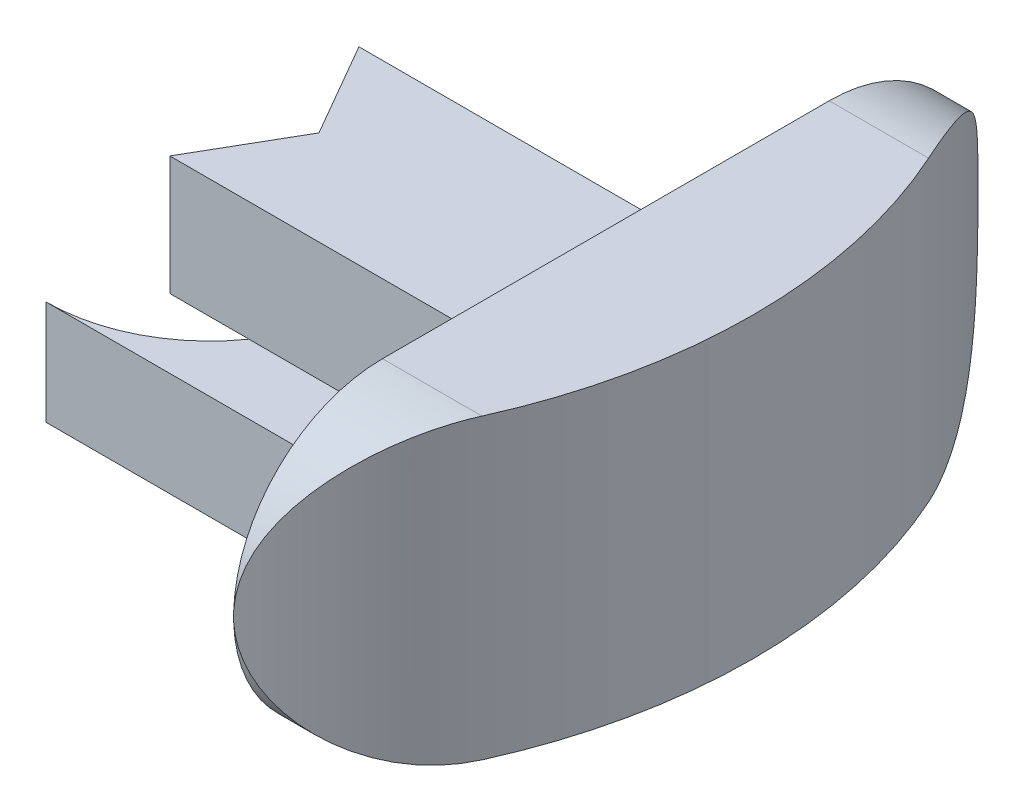
ISO-10303-21;
HEADER;
FILE_DESCRIPTION(('STEP AP214'),'2;1');
FILE_NAME('part.step','',(''),(''),'','','');
FILE_SCHEMA(('AUTOMOTIVE_DESIGN { 1 0 10303 214 1 1 1 1 }'));
ENDSEC;
DATA;
#1=APPLICATION_CONTEXT('core data for automotive mechanical design processes');
#2=APPLICATION_PROTOCOL_DEFINITION('international standard','automotive_design',2000,#1);
#3=PRODUCT_CONTEXT('',#1,'mechanical');
#4=PRODUCT('Part','Part','',(#3));
#5=PRODUCT_RELATED_PRODUCT_CATEGORY('part','',(#4));
#6=PRODUCT_DEFINITION_FORMATION('','',#4);
#7=PRODUCT_DEFINITION_CONTEXT('part definition',#1,'design');
#8=PRODUCT_DEFINITION('design','',#6,#7);
#9=PRODUCT_DEFINITION_SHAPE('','',#8);
#10=(LENGTH_UNIT() NAMED_UNIT(*) SI_UNIT(.MILLI.,.METRE.));
#11=(NAMED_UNIT(*) PLANE_ANGLE_UNIT() SI_UNIT($,.RADIAN.));
#12=(NAMED_UNIT(*) SI_UNIT($,.STERADIAN.) SOLID_ANGLE_UNIT());
#13=UNCERTAINTY_MEASURE_WITH_UNIT(LENGTH_MEASURE(1.E-05),#10,'distance_accuracy_value','');
#14=(GEOMETRIC_REPRESENTATION_CONTEXT(3) GLOBAL_UNCERTAINTY_ASSIGNED_CONTEXT((#13)) GLOBAL_UNIT_ASSIGNED_CONTEXT((#10,
#11,#12)) REPRESENTATION_CONTEXT('',''));
#15=CARTESIAN_POINT('',(0.,0.,0.));
#16=DIRECTION('',(0.,0.,1.));
#17=DIRECTION('',(1.,0.,0.));
#18=AXIS2_PLACEMENT_3D('',#15,#16,#17);
#19=CARTESIAN_POINT('',(38.6,9.,15.));
#20=DIRECTION('',(-1.,0.,0.));
#21=DIRECTION('',(0.,0.,1.));
#22=AXIS2_PLACEMENT_3D('',#19,#20,#21);
#23=CYLINDRICAL_SURFACE('',#22,10.);
#24=CARTESIAN_POINT('',(26.6,9.35210357890602,24.9937992310093));
#25=CARTESIAN_POINT('',(26.6039731203121,9.47222148989784,24.9895691163679));
#26=CARTESIAN_POINT('',(26.6099836757449,9.59217462653272,24.9831721240557));
#27=CARTESIAN_POINT('',(26.6260093181641,9.83149513122165,24.9660926348705));
#28=CARTESIAN_POINT('',(26.6360239991944,9.95086255741615,24.9554105724366));
#29=CARTESIAN_POINT('',(26.6719358160613,10.3073933716122,24.9170443314133));
#30=CARTESIAN_POINT('',(26.7037126734984,10.5433351910731,24.8830275327855));
#31=CARTESIAN_POINT('',(26.7815347884246,11.00745523268,24.7992460144271));
#32=CARTESIAN_POINT('',(26.8274355277001,11.2356872201852,24.7496406947013));
#33=CARTESIAN_POINT('',(26.932295723982,11.6853537574777,24.6354916418739));
#34=CARTESIAN_POINT('',(26.991258608686,11.9067865056471,24.5709439874854));
#35=CARTESIAN_POINT('',(27.1204402577183,12.3405691151106,24.4282809680551));
#36=CARTESIAN_POINT('',(27.1906040587261,12.5529572229503,24.3502317070687));
#37=CARTESIAN_POINT('',(27.3408497093302,12.9688869575278,24.1814131233275));
#38=CARTESIAN_POINT('',(27.4209308784282,13.1724291899483,24.0906446732672));
#39=CARTESIAN_POINT('',(27.6743704848657,13.7701808245318,23.8001069645739));
#40=CARTESIAN_POINT('',(27.8606044340125,14.1504791149211,23.5824531097887));
#41=CARTESIAN_POINT('',(28.2000039212504,14.7682354009671,23.1745331008671));
#42=CARTESIAN_POINT('',(28.3475099055874,15.0155563823267,22.994083759587));
#43=CARTESIAN_POINT('',(28.6514060971131,15.4895917973768,22.6142879990519));
#44=CARTESIAN_POINT('',(28.8077993802628,15.7162990250327,22.414935020946));
#45=CARTESIAN_POINT('',(29.1267840011027,16.1488689543995,21.9988471706816));
#46=CARTESIAN_POINT('',(29.2893814250526,16.3547104234367,21.7820949872696));
#47=CARTESIAN_POINT('',(29.6182532046133,16.7449790010403,21.3327583969444));
#48=CARTESIAN_POINT('',(29.7845271701767,16.9294083683817,21.1001756641186));
#49=CARTESIAN_POINT('',(30.1209078010059,17.2787154936786,20.617193330868));
#50=CARTESIAN_POINT('',(30.2910360910303,17.4433032419393,20.3665991717779));
#51=CARTESIAN_POINT('',(30.6310669120968,17.7494270694321,19.8515231821659));
#52=CARTESIAN_POINT('',(30.8009694250494,17.890961400456,19.5870403004308));
#53=CARTESIAN_POINT('',(31.1384956563494,18.1498993674255,19.0458817443353));
#54=CARTESIAN_POINT('',(31.3061228830653,18.2673453726141,18.7692285361208));
#55=CARTESIAN_POINT('',(31.6377846067367,18.4774037252825,18.2046069416841));
#56=CARTESIAN_POINT('',(31.8018198369269,18.570021185241,17.916640898926));
#57=CARTESIAN_POINT('',(32.0791905274255,18.7068029363687,17.4135923931046));
#58=CARTESIAN_POINT('',(32.1937659429095,18.7572645594182,17.2008840338201));
#59=CARTESIAN_POINT('',(32.4197596702063,18.8443613770289,16.7710500861131));
#60=CARTESIAN_POINT('',(32.531178701237,18.8809997451982,16.5539255236621));
#61=CARTESIAN_POINT('',(32.7504830719602,18.940026537726,16.1157031253022));
#62=CARTESIAN_POINT('',(32.8583647834857,18.9624007401129,15.894601549213));
#63=CARTESIAN_POINT('',(33.0700530696425,18.9923925742663,15.4493567138761));
#64=CARTESIAN_POINT('',(33.173857916813,19.0000040154176,15.2252122182677));
#65=CARTESIAN_POINT('',(33.2753662639497,19.,15.));
#66=B_SPLINE_CURVE_WITH_KNOTS('',3,(#24,#25,#26,#27,#28,#29,#30,#31,#32,#33,#34,#35,#36,#37,#38,
#39,#40,#41,#42,#43,#44,#45,#46,#47,#48,#49,#50,#51,#52,#53,#54,#55,#56,#57,#58,#59,#60,#61,#62,
#63,#64,#65),.UNSPECIFIED.,.F.,.F.,(4,2,2,2,2,2,2,2,2,2,2,2,2,2,2,2,2,2,2,2,4),(0.,
0.360696887689983,0.721357215585299,1.44163142570809,2.1547678332582,2.86809160035052,
3.57801696587919,4.28789364553995,5.71103021487599,6.72940755807806,7.74813954186572,
8.76789797910362,9.78754874350245,10.820650274358,11.8538301118869,12.8851767906448,
13.9163109400388,14.6563538847725,15.396226823419,16.1368362974722,16.8777562715601),.UNSPECIFIED.);
#67=CARTESIAN_POINT('',(26.6,9.35210357890602,24.9937992310093));
#68=VERTEX_POINT('',#67);
#69=CARTESIAN_POINT('',(33.2753662639497,19.,15.));
#70=VERTEX_POINT('',#69);
#71=EDGE_CURVE('E158',#68,#70,#66,.T.);
#72=ORIENTED_EDGE('',*,*,#71,.T.);
#73=DIRECTION('',(-1.,0.,0.));
#74=VECTOR('',#73,1.);
#75=CARTESIAN_POINT('',(38.6,19.,15.));
#76=LINE('',#75,#74);
#77=CARTESIAN_POINT('',(26.6,19.,15.));
#78=VERTEX_POINT('',#77);
#79=EDGE_CURVE('E168',#70,#78,#76,.T.);
#80=ORIENTED_EDGE('',*,*,#79,.T.);
#81=CARTESIAN_POINT('',(26.6,9.,15.));
#82=DIRECTION('',(1.,0.,0.));
#83=DIRECTION('',(0.,0.,-1.));
#84=AXIS2_PLACEMENT_3D('',#81,#82,#83);
#85=CIRCLE('',#84,10.);
#86=EDGE_CURVE('E171',#78,#68,#85,.T.);
#87=ORIENTED_EDGE('',*,*,#86,.T.);
#88=EDGE_LOOP('',(#72,#80,#87));
#89=FACE_BOUND('',#88,.T.);
#90=ADVANCED_FACE('F39',(#89),#23,.T.);
#91=CARTESIAN_POINT('',(33.2753662639497,-0.999999999999999,15.));
#92=CARTESIAN_POINT('',(33.2037865882117,-0.999999200723147,15.1587936888618));
#93=CARTESIAN_POINT('',(33.1310782846771,-0.996217368887177,15.3170474964813));
#94=CARTESIAN_POINT('',(32.983551014986,-0.981243258435668,15.632197931669));
#95=CARTESIAN_POINT('',(32.9087322486585,-0.970051679172206,15.7890946859039));
#96=CARTESIAN_POINT('',(32.6814416490848,-0.925614448949604,16.2571060527177));
#97=CARTESIAN_POINT('',(32.5260102593238,-0.881505765902623,16.5658194648159));
#98=CARTESIAN_POINT('',(32.2093664447421,-0.765852173988446,17.1733418193444));
#99=CARTESIAN_POINT('',(32.0481793474853,-0.694416593382656,17.4721851394315));
#100=CARTESIAN_POINT('',(31.7208564940151,-0.52533868953043,18.0596325433727));
#101=CARTESIAN_POINT('',(31.5547198931167,-0.427691870018089,18.3482348608635));
#102=CARTESIAN_POINT('',(31.2195299630825,-0.207641539747412,18.9129185785973));
#103=CARTESIAN_POINT('',(31.0504854463167,-0.0853037626601614,19.1890308900462));
#104=CARTESIAN_POINT('',(30.710709715046,0.183289997128776,19.7282502616563));
#105=CARTESIAN_POINT('',(30.5399785708766,0.329544986359115,19.9913578614154));
#106=CARTESIAN_POINT('',(30.1981552217356,0.645586634233804,20.5040629171745));
#107=CARTESIAN_POINT('',(30.0270632527174,0.815434364542404,20.7536228939839));
#108=CARTESIAN_POINT('',(29.6869542053374,1.17774856811761,21.2372823001177));
#109=CARTESIAN_POINT('',(29.5179372012982,1.37021584899071,21.471381176954));
#110=CARTESIAN_POINT('',(29.1726261725967,1.79147489856458,21.9385041761919));
#111=CARTESIAN_POINT('',(28.9966418679754,2.02186100928856,22.1703247574055));
#112=CARTESIAN_POINT('',(28.6527595051738,2.50768260533797,22.6130038520815));
#113=CARTESIAN_POINT('',(28.4848634624896,2.76312428655226,22.8238571545411));
#114=CARTESIAN_POINT('',(28.1614064883706,3.29795876177211,23.2217734856163));
#115=CARTESIAN_POINT('',(28.0058154397984,3.57728935958834,23.4088953223027));
#116=CARTESIAN_POINT('',(27.7110505891913,4.15973325426129,23.7570970869388));
#117=CARTESIAN_POINT('',(27.5718643608662,4.4628282564982,23.9181967608236));
#118=CARTESIAN_POINT('',(27.3640462815147,4.97154950659899,24.1551968638334));
#119=CARTESIAN_POINT('',(27.2887460982583,5.17028193133811,24.240163851239));
#120=CARTESIAN_POINT('',(27.1477418857148,5.57577473182526,24.3979773136989));
#121=CARTESIAN_POINT('',(27.0820348559638,5.78253257173094,24.4708275795138));
#122=CARTESIAN_POINT('',(26.9617144970543,6.20278290506659,24.603332177387));
#123=CARTESIAN_POINT('',(26.907073481219,6.41625700731799,24.663019476767));
#124=CARTESIAN_POINT('',(26.8099938118942,6.84924870524917,24.7685158164426));
#125=CARTESIAN_POINT('',(26.7675503487429,7.0687638813337,24.8143303273521));
#126=CARTESIAN_POINT('',(26.6958783045771,7.51314712116637,24.8914218223452));
#127=CARTESIAN_POINT('',(26.6666859709828,7.73802811728294,24.9226589375789));
#128=CARTESIAN_POINT('',(26.6335698292879,8.07768422252846,24.9580288905352));
#129=CARTESIAN_POINT('',(26.6243066555495,8.19138564798315,24.967907943908));
#130=CARTESIAN_POINT('',(26.6094132579338,8.41930738077499,24.9837793566777));
#131=CARTESIAN_POINT('',(26.6037833885578,8.53352773764968,24.9897713368132));
#132=CARTESIAN_POINT('',(26.6,8.64789642109398,24.9937992310093));
#133=B_SPLINE_CURVE_WITH_KNOTS('',3,(#91,#92,#93,#94,#95,#96,#97,#98,#99,#100,#101,#102,#103,
#104,#105,#106,#107,#108,#109,#110,#111,#112,#113,#114,#115,#116,#117,#118,#119,#120,#121,#122,
#123,#124,#125,#126,#127,#128,#129,#130,#131,#132),.UNSPECIFIED.,.F.,.F.,(4,2,2,2,2,2,2,2,2,2,2,
2,2,2,2,2,2,2,2,2,4),(0.,0.522445037323779,1.04484077189456,2.08872160109848,3.12846907125589,
4.16839501340292,5.20558808367008,6.24273808202821,7.28262467061778,8.32254839851456,
9.43468770219956,10.5471027189163,11.656704876063,12.7654610574862,13.4515167750725,
14.1373574522418,14.8214603904824,15.505293206287,16.1909854842,16.534391837958,
16.8778316928012),.UNSPECIFIED.);
#134=CARTESIAN_POINT('',(33.2753662639497,-1.,15.));
#135=VERTEX_POINT('',#134);
#136=CARTESIAN_POINT('',(26.6,8.64789642109398,24.9937992310093));
#137=VERTEX_POINT('',#136);
#138=EDGE_CURVE('E320',#135,#137,#133,.T.);
#139=ORIENTED_EDGE('',*,*,#138,.T.);
#140=CARTESIAN_POINT('',(26.6,-1.,15.));
#141=VERTEX_POINT('',#140);
#142=EDGE_CURVE('E173',#137,#141,#85,.T.);
#143=ORIENTED_EDGE('',*,*,#142,.T.);
#144=DIRECTION('',(-1.,0.,0.));
#145=VECTOR('',#144,1.);
#146=CARTESIAN_POINT('',(38.6,-1.,15.));
#147=LINE('',#146,#145);
#148=EDGE_CURVE('E192',#135,#141,#147,.T.);
#149=ORIENTED_EDGE('',*,*,#148,.F.);
#150=EDGE_LOOP('',(#139,#143,#149));
#151=FACE_BOUND('',#150,.T.);
#152=ADVANCED_FACE('F319',(#151),#23,.T.);
#153=CARTESIAN_POINT('',(38.6,-1.,15.));
#154=DIRECTION('',(0.,1.,0.));
#155=DIRECTION('',(0.,0.,1.));
#156=AXIS2_PLACEMENT_3D('',#153,#154,#155);
#157=PLANE('',#156);
#158=CARTESIAN_POINT('',(0.,-1.,0.));
#159=DIRECTION('',(0.,1.,0.));
#160=DIRECTION('',(0.,0.,1.));
#161=AXIS2_PLACEMENT_3D('',#158,#159,#160);
#162=CIRCLE('',#161,36.5);
#163=CARTESIAN_POINT('',(33.2753662639497,-1.,-15.));
#164=VERTEX_POINT('',#163);
#165=EDGE_CURVE('E328',#164,#135,#162,.F.);
#166=ORIENTED_EDGE('',*,*,#165,.T.);
#167=ORIENTED_EDGE('',*,*,#148,.T.);
#168=DIRECTION('',(0.,0.,-1.));
#169=VECTOR('',#168,1.);
#170=CARTESIAN_POINT('',(26.6,-1.,15.));
#171=LINE('',#170,#169);
#172=CARTESIAN_POINT('',(26.6,-1.,-15.));
#173=VERTEX_POINT('',#172);
#174=EDGE_CURVE('E300',#141,#173,#171,.T.);
#175=ORIENTED_EDGE('',*,*,#174,.T.);
#176=DIRECTION('',(-1.,0.,0.));
#177=VECTOR('',#176,1.);
#178=CARTESIAN_POINT('',(38.6,-1.,-15.));
#179=LINE('',#178,#177);
#180=EDGE_CURVE('E184',#164,#173,#179,.T.);
#181=ORIENTED_EDGE('',*,*,#180,.F.);
#182=EDGE_LOOP('',(#166,#167,#175,#181));
#183=FACE_BOUND('',#182,.T.);
#184=ADVANCED_FACE('F325',(#183),#157,.F.);
#185=CARTESIAN_POINT('',(38.6,9.,-15.));
#186=DIRECTION('',(-1.,0.,0.));
#187=DIRECTION('',(0.,0.,1.));
#188=AXIS2_PLACEMENT_3D('',#185,#186,#187);
#189=CYLINDRICAL_SURFACE('',#188,10.);
#190=CARTESIAN_POINT('',(26.6,8.64789642109398,-24.9937992310093));
#191=CARTESIAN_POINT('',(26.603973120312,8.52777851010216,-24.9895691163679));
#192=CARTESIAN_POINT('',(26.6099836757449,8.40782537346729,-24.9831721240557));
#193=CARTESIAN_POINT('',(26.6260093181641,8.16850486877835,-24.9660926348705));
#194=CARTESIAN_POINT('',(26.6360239991944,8.04913744258385,-24.9554105724366));
#195=CARTESIAN_POINT('',(26.6719358160613,7.69260662838783,-24.9170443314133));
#196=CARTESIAN_POINT('',(26.7037126734984,7.45666480892686,-24.8830275327855));
#197=CARTESIAN_POINT('',(26.7815347884246,6.99254476732002,-24.7992460144271));
#198=CARTESIAN_POINT('',(26.8274355277001,6.76431277981484,-24.7496406947013));
#199=CARTESIAN_POINT('',(26.932295723982,6.3146462425223,-24.6354916418739));
#200=CARTESIAN_POINT('',(26.991258608686,6.09321349435291,-24.5709439874854));
#201=CARTESIAN_POINT('',(27.1204402577183,5.6594308848894,-24.4282809680551));
#202=CARTESIAN_POINT('',(27.1906040587261,5.44704277704972,-24.3502317070687));
#203=CARTESIAN_POINT('',(27.3408497093302,5.03111304247218,-24.1814131233275));
#204=CARTESIAN_POINT('',(27.4209308784282,4.82757081005165,-24.0906446732672));
#205=CARTESIAN_POINT('',(27.6743704848657,4.22981917546823,-23.8001069645739));
#206=CARTESIAN_POINT('',(27.8606044340125,3.84952088507887,-23.5824531097887));
#207=CARTESIAN_POINT('',(28.2000039212504,3.23176459903291,-23.1745331008671));
#208=CARTESIAN_POINT('',(28.3475099055874,2.98444361767329,-22.994083759587));
#209=CARTESIAN_POINT('',(28.6514060971131,2.51040820262317,-22.6142879990519));
#210=CARTESIAN_POINT('',(28.8077993802628,2.28370097496727,-22.414935020946));
#211=CARTESIAN_POINT('',(29.1267840011027,1.85113104560049,-21.9988471706816));
#212=CARTESIAN_POINT('',(29.2893814250526,1.64528957656329,-21.7820949872696));
#213=CARTESIAN_POINT('',(29.6182532046133,1.25502099895968,-21.3327583969444));
#214=CARTESIAN_POINT('',(29.7845271701767,1.07059163161831,-21.1001756641186));
#215=CARTESIAN_POINT('',(30.1209078010059,0.721284506321408,-20.617193330868));
#216=CARTESIAN_POINT('',(30.2910360910303,0.556696758060669,-20.3665991717779));
#217=CARTESIAN_POINT('',(30.6310669120968,0.250572930567931,-19.8515231821659));
#218=CARTESIAN_POINT('',(30.8009694250494,0.109038599543993,-19.5870403004308));
#219=CARTESIAN_POINT('',(31.1384956563494,-0.149899367425552,-19.0458817443353));
#220=CARTESIAN_POINT('',(31.3061228830653,-0.267345372614133,-18.7692285361208));
#221=CARTESIAN_POINT('',(31.6377846067367,-0.47740372528254,-18.2046069416841));
#222=CARTESIAN_POINT('',(31.8018198369269,-0.570021185240969,-17.916640898926));
#223=CARTESIAN_POINT('',(32.0791905274255,-0.706802936368719,-17.4135923931046));
#224=CARTESIAN_POINT('',(32.1937659429095,-0.757264559418187,-17.2008840338201));
#225=CARTESIAN_POINT('',(32.4197596702063,-0.844361377028892,-16.7710500861131));
#226=CARTESIAN_POINT('',(32.531178701237,-0.880999745198182,-16.5539255236621));
#227=CARTESIAN_POINT('',(32.7504830719602,-0.940026537725965,-16.1157031253022));
#228=CARTESIAN_POINT('',(32.8583647834857,-0.962400740112905,-15.894601549213));
#229=CARTESIAN_POINT('',(33.0700530696425,-0.992392574266326,-15.4493567138761));
#230=CARTESIAN_POINT('',(33.173857916813,-1.00000401541757,-15.2252122182677));
#231=CARTESIAN_POINT('',(33.2753662639497,-1.,-15.));
#232=B_SPLINE_CURVE_WITH_KNOTS('',3,(#190,#191,#192,#193,#194,#195,#196,#197,#198,#199,#200,
#201,#202,#203,#204,#205,#206,#207,#208,#209,#210,#211,#212,#213,#214,#215,#216,#217,#218,#219,
#220,#221,#222,#223,#224,#225,#226,#227,#228,#229,#230,#231),.UNSPECIFIED.,.F.,.F.,(4,2,2,2,2,2,
2,2,2,2,2,2,2,2,2,2,2,2,2,2,4),(0.,0.360696887689983,0.721357215585299,1.44163142570809,
2.15476783325819,2.86809160035051,3.57801696587919,4.28789364553996,5.71103021487599,
6.72940755807806,7.74813954186572,8.76789797910363,9.78754874350245,10.820650274358,
11.8538301118869,12.8851767906448,13.9163109400388,14.6563538847725,15.396226823419,
16.1368362974722,16.8777562715601),.UNSPECIFIED.);
#233=CARTESIAN_POINT('',(26.6,8.64789642109398,-24.9937992310093));
#234=VERTEX_POINT('',#233);
#235=EDGE_CURVE('E307',#234,#164,#232,.T.);
#236=ORIENTED_EDGE('',*,*,#235,.T.);
#237=ORIENTED_EDGE('',*,*,#180,.T.);
#238=CARTESIAN_POINT('',(26.6,9.,-15.));
#239=DIRECTION('',(1.,0.,0.));
#240=DIRECTION('',(0.,0.,-1.));
#241=AXIS2_PLACEMENT_3D('',#238,#239,#240);
#242=CIRCLE('',#241,10.);
#243=EDGE_CURVE('E186',#173,#234,#242,.T.);
#244=ORIENTED_EDGE('',*,*,#243,.T.);
#245=EDGE_LOOP('',(#236,#237,#244));
#246=FACE_BOUND('',#245,.T.);
#247=ADVANCED_FACE('F336',(#246),#189,.T.);
#248=CARTESIAN_POINT('',(33.2753662639497,19.,-15.));
#249=CARTESIAN_POINT('',(33.2037865882117,18.9999992007231,-15.1587936888618));
#250=CARTESIAN_POINT('',(33.1310782846771,18.9962173688872,-15.3170474964813));
#251=CARTESIAN_POINT('',(32.983551014986,18.9812432584357,-15.632197931669));
#252=CARTESIAN_POINT('',(32.9087322486585,18.9700516791722,-15.7890946859039));
#253=CARTESIAN_POINT('',(32.6814416490848,18.9256144489496,-16.2571060527177));
#254=CARTESIAN_POINT('',(32.5260102593239,18.8815057659026,-16.5658194648159));
#255=CARTESIAN_POINT('',(32.2093664447421,18.7658521739884,-17.1733418193444));
#256=CARTESIAN_POINT('',(32.0481793474853,18.6944165933827,-17.4721851394315));
#257=CARTESIAN_POINT('',(31.7208564940151,18.5253386895304,-18.0596325433727));
#258=CARTESIAN_POINT('',(31.5547198931166,18.4276918700181,-18.3482348608635));
#259=CARTESIAN_POINT('',(31.2195299630824,18.2076415397474,-18.9129185785973));
#260=CARTESIAN_POINT('',(31.0504854463167,18.0853037626602,-19.1890308900462));
#261=CARTESIAN_POINT('',(30.710709715046,17.8167100028712,-19.7282502616563));
#262=CARTESIAN_POINT('',(30.5399785708766,17.6704550136409,-19.9913578614154));
#263=CARTESIAN_POINT('',(30.1981552217356,17.3544133657662,-20.5040629171746));
#264=CARTESIAN_POINT('',(30.0270632527174,17.1845656354576,-20.7536228939839));
#265=CARTESIAN_POINT('',(29.6869542053374,16.8222514318824,-21.2372823001177));
#266=CARTESIAN_POINT('',(29.5179372012982,16.6297841510093,-21.471381176954));
#267=CARTESIAN_POINT('',(29.1726261725967,16.2085251014354,-21.9385041761919));
#268=CARTESIAN_POINT('',(28.9966418679754,15.9781389907114,-22.1703247574056));
#269=CARTESIAN_POINT('',(28.6527595051738,15.492317394662,-22.6130038520815));
#270=CARTESIAN_POINT('',(28.4848634624896,15.2368757134477,-22.8238571545411));
#271=CARTESIAN_POINT('',(28.1614064883706,14.7020412382279,-23.2217734856163));
#272=CARTESIAN_POINT('',(28.0058154397984,14.4227106404117,-23.4088953223027));
#273=CARTESIAN_POINT('',(27.7110505891913,13.8402667457387,-23.7570970869389));
#274=CARTESIAN_POINT('',(27.5718643608662,13.5371717435018,-23.9181967608236));
#275=CARTESIAN_POINT('',(27.3640462815147,13.028450493401,-24.1551968638334));
#276=CARTESIAN_POINT('',(27.2887460982583,12.8297180686619,-24.240163851239));
#277=CARTESIAN_POINT('',(27.1477418857148,12.4242252681747,-24.3979773136989));
#278=CARTESIAN_POINT('',(27.0820348559638,12.2174674282691,-24.4708275795138));
#279=CARTESIAN_POINT('',(26.9617144970543,11.7972170949334,-24.603332177387));
#280=CARTESIAN_POINT('',(26.907073481219,11.583742992682,-24.663019476767));
#281=CARTESIAN_POINT('',(26.8099938118942,11.1507512947508,-24.7685158164426));
#282=CARTESIAN_POINT('',(26.7675503487429,10.9312361186663,-24.8143303273521));
#283=CARTESIAN_POINT('',(26.6958783045771,10.4868528788336,-24.8914218223452));
#284=CARTESIAN_POINT('',(26.6666859709828,10.2619718827171,-24.9226589375789));
#285=CARTESIAN_POINT('',(26.6335698292879,9.92231577747154,-24.9580288905352));
#286=CARTESIAN_POINT('',(26.6243066555495,9.80861435201685,-24.967907943908));
#287=CARTESIAN_POINT('',(26.6094132579338,9.58069261922501,-24.9837793566777));
#288=CARTESIAN_POINT('',(26.6037833885578,9.46647226235032,-24.9897713368132));
#289=CARTESIAN_POINT('',(26.6,9.35210357890602,-24.9937992310093));
#290=B_SPLINE_CURVE_WITH_KNOTS('',3,(#248,#249,#250,#251,#252,#253,#254,#255,#256,#257,#258,
#259,#260,#261,#262,#263,#264,#265,#266,#267,#268,#269,#270,#271,#272,#273,#274,#275,#276,#277,
#278,#279,#280,#281,#282,#283,#284,#285,#286,#287,#288,#289),.UNSPECIFIED.,.F.,.F.,(4,2,2,2,2,2,
2,2,2,2,2,2,2,2,2,2,2,2,2,2,4),(0.,0.522445037323782,1.04484077189456,2.08872160109849,
3.12846907125589,4.16839501340292,5.20558808367009,6.24273808202822,7.28262467061779,
8.32254839851457,9.43468770219956,10.5471027189163,11.656704876063,12.7654610574862,
13.4515167750725,14.1373574522418,14.8214603904824,15.505293206287,16.1909854842,
16.534391837958,16.8778316928012),.UNSPECIFIED.);
#291=CARTESIAN_POINT('',(33.2753662639497,19.,-15.));
#292=VERTEX_POINT('',#291);
#293=CARTESIAN_POINT('',(26.6,9.35210357890602,-24.9937992310093));
#294=VERTEX_POINT('',#293);
#295=EDGE_CURVE('E59',#292,#294,#290,.T.);
#296=ORIENTED_EDGE('',*,*,#295,.T.);
#297=CARTESIAN_POINT('',(26.6,19.,-15.));
#298=VERTEX_POINT('',#297);
#299=EDGE_CURVE('E296',#294,#298,#242,.T.);
#300=ORIENTED_EDGE('',*,*,#299,.T.);
#301=DIRECTION('',(-1.,0.,0.));
#302=VECTOR('',#301,1.);
#303=CARTESIAN_POINT('',(38.6,19.,-15.));
#304=LINE('',#303,#302);
#305=EDGE_CURVE('E180',#292,#298,#304,.T.);
#306=ORIENTED_EDGE('',*,*,#305,.F.);
#307=EDGE_LOOP('',(#296,#300,#306));
#308=FACE_BOUND('',#307,.T.);
#309=ADVANCED_FACE('F406',(#308),#189,.T.);
#310=CARTESIAN_POINT('',(38.6,19.,15.));
#311=DIRECTION('',(0.,-1.,0.));
#312=DIRECTION('',(0.,0.,-1.));
#313=AXIS2_PLACEMENT_3D('',#310,#311,#312);
#314=PLANE('',#313);
#315=CARTESIAN_POINT('',(0.,19.,0.));
#316=DIRECTION('',(0.,1.,0.));
#317=DIRECTION('',(0.,0.,1.));
#318=AXIS2_PLACEMENT_3D('',#315,#316,#317);
#319=CIRCLE('',#318,36.5);
#320=EDGE_CURVE('E155',#70,#292,#319,.T.);
#321=ORIENTED_EDGE('',*,*,#320,.T.);
#322=ORIENTED_EDGE('',*,*,#305,.T.);
#323=DIRECTION('',(0.,0.,1.));
#324=VECTOR('',#323,1.);
#325=CARTESIAN_POINT('',(26.6,19.,15.));
#326=LINE('',#325,#324);
#327=EDGE_CURVE('E178',#298,#78,#326,.T.);
#328=ORIENTED_EDGE('',*,*,#327,.T.);
#329=ORIENTED_EDGE('',*,*,#79,.F.);
#330=EDGE_LOOP('',(#321,#322,#328,#329));
#331=FACE_BOUND('',#330,.T.);
#332=ADVANCED_FACE('F176',(#331),#314,.F.);
#333=CARTESIAN_POINT('',(0.,7.,0.));
#334=DIRECTION('',(0.,1.,0.));
#335=DIRECTION('',(0.,0.,1.));
#336=AXIS2_PLACEMENT_3D('',#333,#334,#335);
#337=PLANE('',#336);
#338=DIRECTION('',(-1.,0.,0.));
#339=VECTOR('',#338,1.);
#340=CARTESIAN_POINT('',(3.66617420935412,7.,-6.35));
#341=LINE('',#340,#339);
#342=CARTESIAN_POINT('',(26.6,7.,-6.35));
#343=VERTEX_POINT('',#342);
#344=CARTESIAN_POINT('',(8.98206546402329,7.,-6.35));
#345=VERTEX_POINT('',#344);
#346=EDGE_CURVE('E245',#343,#345,#341,.T.);
#347=ORIENTED_EDGE('',*,*,#346,.F.);
#348=DIRECTION('',(0.,0.,-1.));
#349=VECTOR('',#348,1.);
#350=CARTESIAN_POINT('',(26.6,7.,0.));
#351=LINE('',#350,#349);
#352=CARTESIAN_POINT('',(26.6,7.,-11.));
#353=VERTEX_POINT('',#352);
#354=EDGE_CURVE('E67',#343,#353,#351,.T.);
#355=ORIENTED_EDGE('',*,*,#354,.T.);
#356=DIRECTION('',(-1.,0.,0.));
#357=VECTOR('',#356,1.);
#358=CARTESIAN_POINT('',(0.,7.,-11.));
#359=LINE('',#358,#357);
#360=CARTESIAN_POINT('',(0.,7.,-11.));
#361=VERTEX_POINT('',#360);
#362=EDGE_CURVE('E272',#353,#361,#359,.T.);
#363=ORIENTED_EDGE('',*,*,#362,.T.);
#364=CARTESIAN_POINT('',(0.,7.,0.));
#365=DIRECTION('',(0.,-1.,0.));
#366=DIRECTION('',(0.,0.,1.));
#367=AXIS2_PLACEMENT_3D('',#364,#365,#366);
#368=CIRCLE('',#367,11.);
#369=EDGE_CURVE('E262',#361,#345,#368,.T.);
#370=ORIENTED_EDGE('',*,*,#369,.T.);
#371=EDGE_LOOP('',(#347,#355,#363,#370));
#372=FACE_BOUND('',#371,.T.);
#373=ADVANCED_FACE('F405',(#372),#337,.T.);
#374=CARTESIAN_POINT('',(0.,7.,11.));
#375=DIRECTION('',(0.,0.,-1.));
#376=DIRECTION('',(-1.,0.,0.));
#377=AXIS2_PLACEMENT_3D('',#374,#375,#376);
#378=PLANE('',#377);
#379=DIRECTION('',(0.,-1.,0.));
#380=VECTOR('',#379,1.);
#381=CARTESIAN_POINT('',(26.6,7.,11.));
#382=LINE('',#381,#380);
#383=CARTESIAN_POINT('',(26.6,7.,11.));
#384=VERTEX_POINT('',#383);
#385=CARTESIAN_POINT('',(26.6,0.,11.));
#386=VERTEX_POINT('',#385);
#387=EDGE_CURVE('E207',#384,#386,#382,.T.);
#388=ORIENTED_EDGE('',*,*,#387,.F.);
#389=DIRECTION('',(1.,0.,0.));
#390=VECTOR('',#389,1.);
#391=CARTESIAN_POINT('',(0.,7.,11.));
#392=LINE('',#391,#390);
#393=CARTESIAN_POINT('',(0.,7.,11.));
#394=VERTEX_POINT('',#393);
#395=EDGE_CURVE('E266',#394,#384,#392,.T.);
#396=ORIENTED_EDGE('',*,*,#395,.F.);
#397=DIRECTION('',(0.,-1.,0.));
#398=VECTOR('',#397,1.);
#399=CARTESIAN_POINT('',(0.,7.,11.));
#400=LINE('',#399,#398);
#401=CARTESIAN_POINT('',(0.,0.,11.));
#402=VERTEX_POINT('',#401);
#403=EDGE_CURVE('E289',#394,#402,#400,.T.);
#404=ORIENTED_EDGE('',*,*,#403,.T.);
#405=DIRECTION('',(1.,0.,0.));
#406=VECTOR('',#405,1.);
#407=CARTESIAN_POINT('',(0.,0.,11.));
#408=LINE('',#407,#406);
#409=EDGE_CURVE('E279',#402,#386,#408,.T.);
#410=ORIENTED_EDGE('',*,*,#409,.T.);
#411=EDGE_LOOP('',(#388,#396,#404,#410));
#412=FACE_BOUND('',#411,.T.);
#413=ADVANCED_FACE('F439',(#412),#378,.F.);
#414=CARTESIAN_POINT('',(0.,7.,-11.));
#415=DIRECTION('',(0.,0.,1.));
#416=DIRECTION('',(1.,0.,0.));
#417=AXIS2_PLACEMENT_3D('',#414,#415,#416);
#418=PLANE('',#417);
#419=DIRECTION('',(0.,1.,0.));
#420=VECTOR('',#419,1.);
#421=CARTESIAN_POINT('',(26.6,7.,-11.));
#422=LINE('',#421,#420);
#423=CARTESIAN_POINT('',(26.6,0.,-11.));
#424=VERTEX_POINT('',#423);
#425=EDGE_CURVE('E217',#424,#353,#422,.T.);
#426=ORIENTED_EDGE('',*,*,#425,.F.);
#427=DIRECTION('',(-1.,0.,0.));
#428=VECTOR('',#427,1.);
#429=CARTESIAN_POINT('',(0.,0.,-11.));
#430=LINE('',#429,#428);
#431=CARTESIAN_POINT('',(0.,0.,-11.));
#432=VERTEX_POINT('',#431);
#433=EDGE_CURVE('E283',#424,#432,#430,.T.);
#434=ORIENTED_EDGE('',*,*,#433,.T.);
#435=DIRECTION('',(0.,-1.,0.));
#436=VECTOR('',#435,1.);
#437=CARTESIAN_POINT('',(0.,7.,-11.));
#438=LINE('',#437,#436);
#439=EDGE_CURVE('E275',#361,#432,#438,.T.);
#440=ORIENTED_EDGE('',*,*,#439,.F.);
#441=ORIENTED_EDGE('',*,*,#362,.F.);
#442=EDGE_LOOP('',(#426,#434,#440,#441));
#443=FACE_BOUND('',#442,.T.);
#444=ADVANCED_FACE('F444',(#443),#418,.F.);
#445=ORIENTED_EDGE('',*,*,#395,.T.);
#446=DIRECTION('',(0.,0.,-1.));
#447=VECTOR('',#446,1.);
#448=CARTESIAN_POINT('',(26.6,7.,0.));
#449=LINE('',#448,#447);
#450=CARTESIAN_POINT('',(26.6,7.,6.35));
#451=VERTEX_POINT('',#450);
#452=EDGE_CURVE('E204',#384,#451,#449,.T.);
#453=ORIENTED_EDGE('',*,*,#452,.T.);
#454=DIRECTION('',(1.,0.,0.));
#455=VECTOR('',#454,1.);
#456=CARTESIAN_POINT('',(3.66617420935412,7.,6.35));
#457=LINE('',#456,#455);
#458=CARTESIAN_POINT('',(8.9820654640233,7.,6.35));
#459=VERTEX_POINT('',#458);
#460=EDGE_CURVE('E51',#459,#451,#457,.T.);
#461=ORIENTED_EDGE('',*,*,#460,.F.);
#462=EDGE_CURVE('E268',#459,#394,#368,.T.);
#463=ORIENTED_EDGE('',*,*,#462,.T.);
#464=EDGE_LOOP('',(#445,#453,#461,#463));
#465=FACE_BOUND('',#464,.T.);
#466=ADVANCED_FACE('F440',(#465),#337,.T.);
#467=CARTESIAN_POINT('',(0.,0.,0.));
#468=DIRECTION('',(0.,1.,0.));
#469=DIRECTION('',(0.,0.,1.));
#470=AXIS2_PLACEMENT_3D('',#467,#468,#469);
#471=PLANE('',#470);
#472=DIRECTION('',(0.,0.,-1.));
#473=VECTOR('',#472,1.);
#474=CARTESIAN_POINT('',(26.6,0.,0.));
#475=LINE('',#474,#473);
#476=EDGE_CURVE('E213',#386,#424,#475,.T.);
#477=ORIENTED_EDGE('',*,*,#476,.F.);
#478=ORIENTED_EDGE('',*,*,#409,.F.);
#479=CARTESIAN_POINT('',(0.,0.,0.));
#480=DIRECTION('',(0.,-1.,0.));
#481=DIRECTION('',(0.,0.,1.));
#482=AXIS2_PLACEMENT_3D('',#479,#480,#481);
#483=CIRCLE('',#482,11.);
#484=EDGE_CURVE('E261',#432,#402,#483,.T.);
#485=ORIENTED_EDGE('',*,*,#484,.F.);
#486=ORIENTED_EDGE('',*,*,#433,.F.);
#487=EDGE_LOOP('',(#477,#478,#485,#486));
#488=FACE_BOUND('',#487,.T.);
#489=ADVANCED_FACE('F432',(#488),#471,.F.);
#490=CARTESIAN_POINT('',(3.66617420935412,15.,6.35));
#491=DIRECTION('',(0.,0.,-1.));
#492=DIRECTION('',(-1.,0.,0.));
#493=AXIS2_PLACEMENT_3D('',#490,#491,#492);
#494=PLANE('',#493);
#495=DIRECTION('',(0.,-1.,0.));
#496=VECTOR('',#495,1.);
#497=CARTESIAN_POINT('',(26.6,15.,6.35));
#498=LINE('',#497,#496);
#499=CARTESIAN_POINT('',(26.6,15.,6.35));
#500=VERTEX_POINT('',#499);
#501=EDGE_CURVE('E200',#500,#451,#498,.T.);
#502=ORIENTED_EDGE('',*,*,#501,.F.);
#503=DIRECTION('',(1.,0.,0.));
#504=VECTOR('',#503,1.);
#505=CARTESIAN_POINT('',(3.66617420935412,15.,6.35));
#506=LINE('',#505,#504);
#507=CARTESIAN_POINT('',(3.66617420935412,15.,6.35));
#508=VERTEX_POINT('',#507);
#509=EDGE_CURVE('E226',#508,#500,#506,.T.);
#510=ORIENTED_EDGE('',*,*,#509,.F.);
#511=DIRECTION('',(0.,-1.,0.));
#512=VECTOR('',#511,1.);
#513=CARTESIAN_POINT('',(3.66617420935412,15.,6.35));
#514=LINE('',#513,#512);
#515=CARTESIAN_POINT('',(3.66617420935412,7.,6.35));
#516=VERTEX_POINT('',#515);
#517=EDGE_CURVE('E257',#508,#516,#514,.T.);
#518=ORIENTED_EDGE('',*,*,#517,.T.);
#519=EDGE_CURVE('E240',#516,#459,#457,.T.);
#520=ORIENTED_EDGE('',*,*,#519,.T.);
#521=ORIENTED_EDGE('',*,*,#460,.T.);
#522=EDGE_LOOP('',(#502,#510,#518,#520,#521));
#523=FACE_BOUND('',#522,.T.);
#524=ADVANCED_FACE('F428',(#523),#494,.F.);
#525=CARTESIAN_POINT('',(3.66617420935412,15.,-6.35));
#526=DIRECTION('',(0.,0.,1.));
#527=DIRECTION('',(1.,0.,0.));
#528=AXIS2_PLACEMENT_3D('',#525,#526,#527);
#529=PLANE('',#528);
#530=DIRECTION('',(0.,1.,0.));
#531=VECTOR('',#530,1.);
#532=CARTESIAN_POINT('',(26.6,15.,-6.35));
#533=LINE('',#532,#531);
#534=CARTESIAN_POINT('',(26.6,15.,-6.35));
#535=VERTEX_POINT('',#534);
#536=EDGE_CURVE('E196',#343,#535,#533,.T.);
#537=ORIENTED_EDGE('',*,*,#536,.F.);
#538=ORIENTED_EDGE('',*,*,#346,.T.);
#539=CARTESIAN_POINT('',(3.66617420935412,7.,-6.35));
#540=VERTEX_POINT('',#539);
#541=EDGE_CURVE('E244',#345,#540,#341,.T.);
#542=ORIENTED_EDGE('',*,*,#541,.T.);
#543=DIRECTION('',(0.,-1.,0.));
#544=VECTOR('',#543,1.);
#545=CARTESIAN_POINT('',(3.66617420935412,15.,-6.35));
#546=LINE('',#545,#544);
#547=CARTESIAN_POINT('',(3.66617420935412,15.,-6.35));
#548=VERTEX_POINT('',#547);
#549=EDGE_CURVE('E253',#548,#540,#546,.T.);
#550=ORIENTED_EDGE('',*,*,#549,.F.);
#551=DIRECTION('',(-1.,0.,0.));
#552=VECTOR('',#551,1.);
#553=CARTESIAN_POINT('',(3.66617420935412,15.,-6.35));
#554=LINE('',#553,#552);
#555=EDGE_CURVE('E230',#535,#548,#554,.T.);
#556=ORIENTED_EDGE('',*,*,#555,.F.);
#557=EDGE_LOOP('',(#537,#538,#542,#550,#556));
#558=FACE_BOUND('',#557,.T.);
#559=ADVANCED_FACE('F416',(#558),#529,.F.);
#560=CARTESIAN_POINT('',(0.,15.,0.));
#561=DIRECTION('',(0.,-1.,0.));
#562=DIRECTION('',(0.,0.,-1.));
#563=AXIS2_PLACEMENT_3D('',#560,#561,#562);
#564=PLANE('',#563);
#565=DIRECTION('',(0.,0.,1.));
#566=VECTOR('',#565,1.);
#567=CARTESIAN_POINT('',(26.6,15.,0.));
#568=LINE('',#567,#566);
#569=EDGE_CURVE('E11',#535,#500,#568,.T.);
#570=ORIENTED_EDGE('',*,*,#569,.F.);
#571=ORIENTED_EDGE('',*,*,#555,.T.);
#572=DIRECTION('',(0.5,0.,0.866025403784438));
#573=VECTOR('',#572,1.);
#574=CARTESIAN_POINT('',(7.33234841870824,15.,0.));
#575=LINE('',#574,#573);
#576=CARTESIAN_POINT('',(7.33234841870824,15.,0.));
#577=VERTEX_POINT('',#576);
#578=EDGE_CURVE('E233',#548,#577,#575,.T.);
#579=ORIENTED_EDGE('',*,*,#578,.T.);
#580=DIRECTION('',(-0.5,0.,0.866025403784439));
#581=VECTOR('',#580,1.);
#582=CARTESIAN_POINT('',(3.66617420935412,15.,6.35));
#583=LINE('',#582,#581);
#584=EDGE_CURVE('E222',#577,#508,#583,.T.);
#585=ORIENTED_EDGE('',*,*,#584,.T.);
#586=ORIENTED_EDGE('',*,*,#509,.T.);
#587=EDGE_LOOP('',(#570,#571,#579,#585,#586));
#588=FACE_BOUND('',#587,.T.);
#589=ADVANCED_FACE('F413',(#588),#564,.F.);
#590=CARTESIAN_POINT('',(0.,7.,0.));
#591=DIRECTION('',(0.,-1.,0.));
#592=DIRECTION('',(0.,0.,-1.));
#593=AXIS2_PLACEMENT_3D('',#590,#591,#592);
#594=CYLINDRICAL_SURFACE('',#593,11.);
#595=ORIENTED_EDGE('',*,*,#484,.T.);
#596=ORIENTED_EDGE('',*,*,#403,.F.);
#597=ORIENTED_EDGE('',*,*,#462,.F.);
#598=EDGE_CURVE('E267',#345,#459,#368,.T.);
#599=ORIENTED_EDGE('',*,*,#598,.F.);
#600=ORIENTED_EDGE('',*,*,#369,.F.);
#601=ORIENTED_EDGE('',*,*,#439,.T.);
#602=EDGE_LOOP('',(#595,#596,#597,#599,#600,#601));
#603=FACE_BOUND('',#602,.T.);
#604=ADVANCED_FACE('F41',(#603),#594,.F.);
#605=CARTESIAN_POINT('',(3.66617420935412,15.,6.35));
#606=DIRECTION('',(0.866025403784439,0.,0.5));
#607=DIRECTION('',(0.5,0.,-0.866025403784439));
#608=AXIS2_PLACEMENT_3D('',#605,#606,#607);
#609=PLANE('',#608);
#610=DIRECTION('',(-0.5,0.,0.866025403784439));
#611=VECTOR('',#610,1.);
#612=CARTESIAN_POINT('',(3.66617420935412,7.,6.35));
#613=LINE('',#612,#611);
#614=CARTESIAN_POINT('',(7.33234841870824,7.,0.));
#615=VERTEX_POINT('',#614);
#616=EDGE_CURVE('E221',#615,#516,#613,.T.);
#617=ORIENTED_EDGE('',*,*,#616,.T.);
#618=ORIENTED_EDGE('',*,*,#517,.F.);
#619=ORIENTED_EDGE('',*,*,#584,.F.);
#620=DIRECTION('',(0.,-1.,0.));
#621=VECTOR('',#620,1.);
#622=CARTESIAN_POINT('',(7.33234841870824,15.,0.));
#623=LINE('',#622,#621);
#624=EDGE_CURVE('E236',#577,#615,#623,.T.);
#625=ORIENTED_EDGE('',*,*,#624,.T.);
#626=EDGE_LOOP('',(#617,#618,#619,#625));
#627=FACE_BOUND('',#626,.T.);
#628=ADVANCED_FACE('F424',(#627),#609,.F.);
#629=CARTESIAN_POINT('',(7.33234841870824,15.,0.));
#630=DIRECTION('',(0.866025403784439,0.,-0.5));
#631=DIRECTION('',(-0.5,0.,-0.866025403784438));
#632=AXIS2_PLACEMENT_3D('',#629,#630,#631);
#633=PLANE('',#632);
#634=DIRECTION('',(0.5,0.,0.866025403784438));
#635=VECTOR('',#634,1.);
#636=CARTESIAN_POINT('',(7.33234841870824,7.,0.));
#637=LINE('',#636,#635);
#638=EDGE_CURVE('E227',#540,#615,#637,.T.);
#639=ORIENTED_EDGE('',*,*,#638,.T.);
#640=ORIENTED_EDGE('',*,*,#624,.F.);
#641=ORIENTED_EDGE('',*,*,#578,.F.);
#642=ORIENTED_EDGE('',*,*,#549,.T.);
#643=EDGE_LOOP('',(#639,#640,#641,#642));
#644=FACE_BOUND('',#643,.T.);
#645=ADVANCED_FACE('F420',(#644),#633,.F.);
#646=CARTESIAN_POINT('',(0.,7.,0.));
#647=DIRECTION('',(0.,-1.,0.));
#648=DIRECTION('',(0.,0.,-1.));
#649=AXIS2_PLACEMENT_3D('',#646,#647,#648);
#650=PLANE('',#649);
#651=ORIENTED_EDGE('',*,*,#541,.F.);
#652=ORIENTED_EDGE('',*,*,#598,.T.);
#653=ORIENTED_EDGE('',*,*,#519,.F.);
#654=ORIENTED_EDGE('',*,*,#616,.F.);
#655=ORIENTED_EDGE('',*,*,#638,.F.);
#656=EDGE_LOOP('',(#651,#652,#653,#654,#655));
#657=FACE_BOUND('',#656,.T.);
#658=ADVANCED_FACE('F401',(#657),#650,.T.);
#659=CARTESIAN_POINT('',(26.6,9.,15.));
#660=DIRECTION('',(1.,0.,0.));
#661=DIRECTION('',(0.,0.,-1.));
#662=AXIS2_PLACEMENT_3D('',#659,#660,#661);
#663=PLANE('',#662);
#664=ORIENTED_EDGE('',*,*,#86,.F.);
#665=ORIENTED_EDGE('',*,*,#327,.F.);
#666=ORIENTED_EDGE('',*,*,#299,.F.);
#667=CARTESIAN_POINT('',(26.6,8.64789642109398,-24.9937992310093));
#668=DIRECTION('',(0.,1.,0.));
#669=VECTOR('',#668,1.);
#670=LINE('',#667,#669);
#671=EDGE_CURVE('E333',#234,#294,#670,.T.);
#672=ORIENTED_EDGE('',*,*,#671,.F.);
#673=ORIENTED_EDGE('',*,*,#243,.F.);
#674=ORIENTED_EDGE('',*,*,#174,.F.);
#675=ORIENTED_EDGE('',*,*,#142,.F.);
#676=CARTESIAN_POINT('',(26.6,9.35210357890602,24.9937992310093));
#677=DIRECTION('',(0.,-1.,0.));
#678=VECTOR('',#677,1.);
#679=LINE('',#676,#678);
#680=EDGE_CURVE('E174',#68,#137,#679,.T.);
#681=ORIENTED_EDGE('',*,*,#680,.F.);
#682=EDGE_LOOP('',(#664,#665,#666,#672,#673,#674,#675,#681));
#683=FACE_BOUND('',#682,.T.);
#684=ORIENTED_EDGE('',*,*,#476,.T.);
#685=ORIENTED_EDGE('',*,*,#425,.T.);
#686=ORIENTED_EDGE('',*,*,#354,.F.);
#687=ORIENTED_EDGE('',*,*,#536,.T.);
#688=ORIENTED_EDGE('',*,*,#569,.T.);
#689=ORIENTED_EDGE('',*,*,#501,.T.);
#690=ORIENTED_EDGE('',*,*,#452,.F.);
#691=ORIENTED_EDGE('',*,*,#387,.T.);
#692=EDGE_LOOP('',(#684,#685,#686,#687,#688,#689,#690,#691));
#693=FACE_BOUND('',#692,.T.);
#694=ADVANCED_FACE('F329',(#683,#693),#663,.F.);
#695=CARTESIAN_POINT('',(0.,-1.001,0.));
#696=DIRECTION('',(0.,1.,0.));
#697=DIRECTION('',(0.,0.,1.));
#698=AXIS2_PLACEMENT_3D('',#695,#696,#697);
#699=CYLINDRICAL_SURFACE('',#698,36.5);
#700=ORIENTED_EDGE('',*,*,#680,.T.);
#701=ORIENTED_EDGE('',*,*,#138,.F.);
#702=ORIENTED_EDGE('',*,*,#165,.F.);
#703=ORIENTED_EDGE('',*,*,#235,.F.);
#704=ORIENTED_EDGE('',*,*,#671,.T.);
#705=ORIENTED_EDGE('',*,*,#295,.F.);
#706=ORIENTED_EDGE('',*,*,#320,.F.);
#707=ORIENTED_EDGE('',*,*,#71,.F.);
#708=EDGE_LOOP('',(#700,#701,#702,#703,#704,#705,#706,#707));
#709=FACE_BOUND('',#708,.T.);
#710=ADVANCED_FACE('F157',(#709),#699,.T.);
#711=CLOSED_SHELL('',(#90,#152,#184,#247,#309,#332,#373,#413,#444,#466,#489,#524,#559,#589,#604,
#628,#645,#658,#694,#710));
#712=MANIFOLD_SOLID_BREP('B2',#711);
#713=ADVANCED_BREP_SHAPE_REPRESENTATION('',(#18,#712),#14);
#714=SHAPE_DEFINITION_REPRESENTATION(#9,#713);
ENDSEC;
END-ISO-10303-21;
